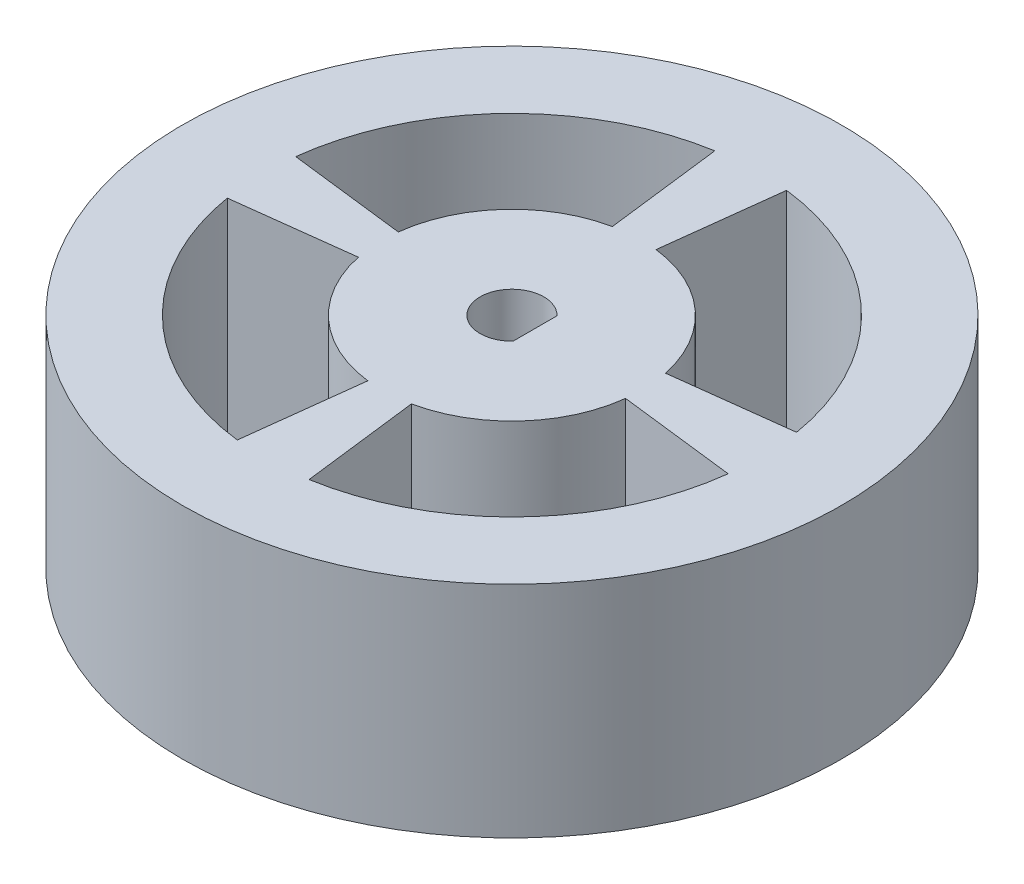
ISO-10303-21;
HEADER;
FILE_DESCRIPTION(('STEP AP214'),'2;1');
FILE_NAME('part.step','',(''),(''),'','','');
FILE_SCHEMA(('AUTOMOTIVE_DESIGN { 1 0 10303 214 1 1 1 1 }'));
ENDSEC;
DATA;
#1=APPLICATION_CONTEXT('core data for automotive mechanical design processes');
#2=APPLICATION_PROTOCOL_DEFINITION('international standard','automotive_design',2000,#1);
#3=PRODUCT_CONTEXT('',#1,'mechanical');
#4=PRODUCT('Part','Part','',(#3));
#5=PRODUCT_RELATED_PRODUCT_CATEGORY('part','',(#4));
#6=PRODUCT_DEFINITION_FORMATION('','',#4);
#7=PRODUCT_DEFINITION_CONTEXT('part definition',#1,'design');
#8=PRODUCT_DEFINITION('design','',#6,#7);
#9=PRODUCT_DEFINITION_SHAPE('','',#8);
#10=(LENGTH_UNIT() NAMED_UNIT(*) SI_UNIT(.MILLI.,.METRE.));
#11=(NAMED_UNIT(*) PLANE_ANGLE_UNIT() SI_UNIT($,.RADIAN.));
#12=(NAMED_UNIT(*) SI_UNIT($,.STERADIAN.) SOLID_ANGLE_UNIT());
#13=UNCERTAINTY_MEASURE_WITH_UNIT(LENGTH_MEASURE(1.E-05),#10,'distance_accuracy_value','');
#14=(GEOMETRIC_REPRESENTATION_CONTEXT(3) GLOBAL_UNCERTAINTY_ASSIGNED_CONTEXT((#13)) GLOBAL_UNIT_ASSIGNED_CONTEXT((#10,
#11,#12)) REPRESENTATION_CONTEXT('',''));
#15=CARTESIAN_POINT('',(0.,0.,0.));
#16=DIRECTION('',(0.,0.,1.));
#17=DIRECTION('',(1.,0.,0.));
#18=AXIS2_PLACEMENT_3D('',#15,#16,#17);
#19=CARTESIAN_POINT('',(0.,10.,0.));
#20=DIRECTION('',(0.,1.,0.));
#21=DIRECTION('',(0.,0.,1.));
#22=AXIS2_PLACEMENT_3D('',#19,#20,#21);
#23=PLANE('',#22);
#24=CARTESIAN_POINT('',(0.,10.,0.));
#25=DIRECTION('',(0.,1.,0.));
#26=DIRECTION('',(0.,0.,1.));
#27=AXIS2_PLACEMENT_3D('',#24,#25,#26);
#28=CIRCLE('',#27,15.);
#29=CARTESIAN_POINT('',(0.,10.,15.));
#30=VERTEX_POINT('',#29);
#31=EDGE_CURVE('E11',#30,#30,#28,.T.);
#32=ORIENTED_EDGE('',*,*,#31,.T.);
#33=EDGE_LOOP('',(#32));
#34=FACE_BOUND('',#33,.T.);
#35=DIRECTION('',(0.,0.,-1.));
#36=VECTOR('',#35,1.);
#37=CARTESIAN_POINT('',(1.05,10.,1.));
#38=LINE('',#37,#36);
#39=CARTESIAN_POINT('',(1.05,10.,1.));
#40=VERTEX_POINT('',#39);
#41=CARTESIAN_POINT('',(1.05,10.,-1.));
#42=VERTEX_POINT('',#41);
#43=EDGE_CURVE('E346',#40,#42,#38,.T.);
#44=ORIENTED_EDGE('',*,*,#43,.F.);
#45=CARTESIAN_POINT('',(0.,10.,0.));
#46=DIRECTION('',(0.,1.,0.));
#47=DIRECTION('',(0.,0.,-1.));
#48=AXIS2_PLACEMENT_3D('',#45,#46,#47);
#49=CIRCLE('',#48,1.45);
#50=EDGE_CURVE('E342',#42,#40,#49,.T.);
#51=ORIENTED_EDGE('',*,*,#50,.F.);
#52=EDGE_LOOP('',(#44,#51));
#53=FACE_BOUND('',#52,.T.);
#54=DIRECTION('',(0.122015532527619,0.,0.992528190945729));
#55=VECTOR('',#54,1.);
#56=CARTESIAN_POINT('',(1.20846299032433,10.,5.78116292968569));
#57=LINE('',#56,#55);
#58=CARTESIAN_POINT('',(1.20846299032433,10.,5.78116292968569));
#59=VERTEX_POINT('',#58);
#60=CARTESIAN_POINT('',(1.86170101699793,10.,11.0948893335314));
#61=VERTEX_POINT('',#60);
#62=EDGE_CURVE('E302',#59,#61,#57,.T.);
#63=ORIENTED_EDGE('',*,*,#62,.F.);
#64=CARTESIAN_POINT('',(0.,10.,0.));
#65=DIRECTION('',(0.,-1.,0.));
#66=DIRECTION('',(0.,0.,-1.));
#67=AXIS2_PLACEMENT_3D('',#64,#65,#66);
#68=CIRCLE('',#67,5.90611781279002);
#69=CARTESIAN_POINT('',(5.86524818391062,10.,0.693607496851631));
#70=VERTEX_POINT('',#69);
#71=EDGE_CURVE('E299',#70,#59,#68,.T.);
#72=ORIENTED_EDGE('',*,*,#71,.F.);
#73=DIRECTION('',(-0.992884130432348,0.,-0.11908443867945));
#74=VECTOR('',#73,1.);
#75=CARTESIAN_POINT('',(5.86524818391062,10.,0.693607496851631));
#76=LINE('',#75,#74);
#77=CARTESIAN_POINT('',(11.1711078276674,10.,1.32998116626821));
#78=VERTEX_POINT('',#77);
#79=EDGE_CURVE('E310',#78,#70,#76,.T.);
#80=ORIENTED_EDGE('',*,*,#79,.F.);
#81=CARTESIAN_POINT('',(0.,10.,0.));
#82=DIRECTION('',(0.,1.,0.));
#83=DIRECTION('',(0.,0.,-1.));
#84=AXIS2_PLACEMENT_3D('',#81,#82,#83);
#85=CIRCLE('',#84,11.25);
#86=EDGE_CURVE('E306',#61,#78,#85,.T.);
#87=ORIENTED_EDGE('',*,*,#86,.F.);
#88=EDGE_LOOP('',(#63,#72,#80,#87));
#89=FACE_BOUND('',#88,.T.);
#90=DIRECTION('',(-0.992528190945729,0.,0.122015532527619));
#91=VECTOR('',#90,1.);
#92=CARTESIAN_POINT('',(-5.78116292968569,10.,1.20846299032433));
#93=LINE('',#92,#91);
#94=CARTESIAN_POINT('',(-5.78116292968569,10.,1.20846299032433));
#95=VERTEX_POINT('',#94);
#96=CARTESIAN_POINT('',(-11.0948893335314,10.,1.86170101699793));
#97=VERTEX_POINT('',#96);
#98=EDGE_CURVE('E259',#95,#97,#93,.T.);
#99=ORIENTED_EDGE('',*,*,#98,.F.);
#100=CARTESIAN_POINT('',(0.,10.,0.));
#101=DIRECTION('',(0.,-1.,0.));
#102=DIRECTION('',(0.,0.,-1.));
#103=AXIS2_PLACEMENT_3D('',#100,#101,#102);
#104=CIRCLE('',#103,5.90611781279002);
#105=CARTESIAN_POINT('',(-0.693607496851652,10.,5.86524818391062));
#106=VERTEX_POINT('',#105);
#107=EDGE_CURVE('E256',#106,#95,#104,.T.);
#108=ORIENTED_EDGE('',*,*,#107,.F.);
#109=DIRECTION('',(0.119084438679446,0.,-0.992884130432349));
#110=VECTOR('',#109,1.);
#111=CARTESIAN_POINT('',(-0.693607496851652,10.,5.86524818391062));
#112=LINE('',#111,#110);
#113=CARTESIAN_POINT('',(-1.32998116626821,10.,11.1711078276674));
#114=VERTEX_POINT('',#113);
#115=EDGE_CURVE('E267',#114,#106,#112,.T.);
#116=ORIENTED_EDGE('',*,*,#115,.F.);
#117=CARTESIAN_POINT('',(0.,10.,0.));
#118=DIRECTION('',(0.,1.,0.));
#119=DIRECTION('',(0.,0.,-1.));
#120=AXIS2_PLACEMENT_3D('',#117,#118,#119);
#121=CIRCLE('',#120,11.25);
#122=EDGE_CURVE('E263',#97,#114,#121,.T.);
#123=ORIENTED_EDGE('',*,*,#122,.F.);
#124=EDGE_LOOP('',(#99,#108,#116,#123));
#125=FACE_BOUND('',#124,.T.);
#126=DIRECTION('',(-0.122015532527619,0.,-0.992528190945729));
#127=VECTOR('',#126,1.);
#128=CARTESIAN_POINT('',(-1.20846299032433,10.,-5.78116292968569));
#129=LINE('',#128,#127);
#130=CARTESIAN_POINT('',(-1.20846299032433,10.,-5.78116292968569));
#131=VERTEX_POINT('',#130);
#132=CARTESIAN_POINT('',(-1.86170101699793,10.,-11.0948893335314));
#133=VERTEX_POINT('',#132);
#134=EDGE_CURVE('E216',#131,#133,#129,.T.);
#135=ORIENTED_EDGE('',*,*,#134,.F.);
#136=CARTESIAN_POINT('',(0.,10.,0.));
#137=DIRECTION('',(0.,-1.,0.));
#138=DIRECTION('',(0.,0.,-1.));
#139=AXIS2_PLACEMENT_3D('',#136,#137,#138);
#140=CIRCLE('',#139,5.90611781279002);
#141=CARTESIAN_POINT('',(-5.86524818391061,10.,-0.693607496851674));
#142=VERTEX_POINT('',#141);
#143=EDGE_CURVE('E213',#142,#131,#140,.T.);
#144=ORIENTED_EDGE('',*,*,#143,.F.);
#145=DIRECTION('',(0.992884130432349,0.,0.119084438679442));
#146=VECTOR('',#145,1.);
#147=CARTESIAN_POINT('',(-5.86524818391061,10.,-0.693607496851674));
#148=LINE('',#147,#146);
#149=CARTESIAN_POINT('',(-11.1711078276674,10.,-1.32998116626821));
#150=VERTEX_POINT('',#149);
#151=EDGE_CURVE('E224',#150,#142,#148,.T.);
#152=ORIENTED_EDGE('',*,*,#151,.F.);
#153=CARTESIAN_POINT('',(0.,10.,0.));
#154=DIRECTION('',(0.,1.,0.));
#155=DIRECTION('',(0.,0.,-1.));
#156=AXIS2_PLACEMENT_3D('',#153,#154,#155);
#157=CIRCLE('',#156,11.25);
#158=EDGE_CURVE('E220',#133,#150,#157,.T.);
#159=ORIENTED_EDGE('',*,*,#158,.F.);
#160=EDGE_LOOP('',(#135,#144,#152,#159));
#161=FACE_BOUND('',#160,.T.);
#162=DIRECTION('',(0.992528190945729,0.,-0.122015532527619));
#163=VECTOR('',#162,1.);
#164=CARTESIAN_POINT('',(5.78116292968569,10.,-1.20846299032433));
#165=LINE('',#164,#163);
#166=CARTESIAN_POINT('',(5.78116292968569,10.,-1.20846299032433));
#167=VERTEX_POINT('',#166);
#168=CARTESIAN_POINT('',(11.0948893335314,10.,-1.86170101699793));
#169=VERTEX_POINT('',#168);
#170=EDGE_CURVE('E174',#167,#169,#165,.T.);
#171=ORIENTED_EDGE('',*,*,#170,.F.);
#172=CARTESIAN_POINT('',(0.,10.,0.));
#173=DIRECTION('',(0.,-1.,0.));
#174=DIRECTION('',(0.,0.,-1.));
#175=AXIS2_PLACEMENT_3D('',#172,#173,#174);
#176=CIRCLE('',#175,5.90611781279003);
#177=CARTESIAN_POINT('',(0.693607496851692,10.,-5.86524818391061));
#178=VERTEX_POINT('',#177);
#179=EDGE_CURVE('E165',#178,#167,#176,.T.);
#180=ORIENTED_EDGE('',*,*,#179,.F.);
#181=DIRECTION('',(-0.119084438679439,0.,0.99288413043235));
#182=VECTOR('',#181,1.);
#183=CARTESIAN_POINT('',(0.693607496851692,10.,-5.86524818391061));
#184=LINE('',#183,#182);
#185=CARTESIAN_POINT('',(1.32998116626821,10.,-11.1711078276674));
#186=VERTEX_POINT('',#185);
#187=EDGE_CURVE('E191',#186,#178,#184,.T.);
#188=ORIENTED_EDGE('',*,*,#187,.F.);
#189=CARTESIAN_POINT('',(0.,10.,0.));
#190=DIRECTION('',(0.,1.,0.));
#191=DIRECTION('',(0.,0.,-1.));
#192=AXIS2_PLACEMENT_3D('',#189,#190,#191);
#193=CIRCLE('',#192,11.25);
#194=EDGE_CURVE('E187',#169,#186,#193,.T.);
#195=ORIENTED_EDGE('',*,*,#194,.F.);
#196=EDGE_LOOP('',(#171,#180,#188,#195));
#197=FACE_BOUND('',#196,.T.);
#198=ADVANCED_FACE('F39',(#34,#53,#89,#125,#161,#197),#23,.T.);
#199=CARTESIAN_POINT('',(0.,0.,0.));
#200=DIRECTION('',(0.,1.,0.));
#201=DIRECTION('',(0.,0.,1.));
#202=AXIS2_PLACEMENT_3D('',#199,#200,#201);
#203=PLANE('',#202);
#204=CARTESIAN_POINT('',(0.,0.,0.));
#205=DIRECTION('',(0.,-1.,0.));
#206=DIRECTION('',(0.,0.,-1.));
#207=AXIS2_PLACEMENT_3D('',#204,#205,#206);
#208=CIRCLE('',#207,5.90611781279002);
#209=CARTESIAN_POINT('',(-5.86524818391061,0.,-0.693607496851674));
#210=VERTEX_POINT('',#209);
#211=CARTESIAN_POINT('',(-1.20846299032433,0.,-5.78116292968569));
#212=VERTEX_POINT('',#211);
#213=EDGE_CURVE('E183',#210,#212,#208,.T.);
#214=ORIENTED_EDGE('',*,*,#213,.T.);
#215=DIRECTION('',(-0.122015532527619,0.,-0.992528190945729));
#216=VECTOR('',#215,1.);
#217=CARTESIAN_POINT('',(-1.20846299032433,0.,-5.78116292968569));
#218=LINE('',#217,#216);
#219=CARTESIAN_POINT('',(-1.86170101699793,0.,-11.0948893335314));
#220=VERTEX_POINT('',#219);
#221=EDGE_CURVE('E231',#212,#220,#218,.T.);
#222=ORIENTED_EDGE('',*,*,#221,.T.);
#223=CARTESIAN_POINT('',(0.,0.,0.));
#224=DIRECTION('',(0.,1.,0.));
#225=DIRECTION('',(0.,0.,-1.));
#226=AXIS2_PLACEMENT_3D('',#223,#224,#225);
#227=CIRCLE('',#226,11.25);
#228=CARTESIAN_POINT('',(-11.1711078276674,0.,-1.32998116626821));
#229=VERTEX_POINT('',#228);
#230=EDGE_CURVE('E235',#220,#229,#227,.T.);
#231=ORIENTED_EDGE('',*,*,#230,.T.);
#232=DIRECTION('',(0.992884130432349,0.,0.119084438679442));
#233=VECTOR('',#232,1.);
#234=CARTESIAN_POINT('',(-5.86524818391061,0.,-0.693607496851674));
#235=LINE('',#234,#233);
#236=EDGE_CURVE('E217',#229,#210,#235,.T.);
#237=ORIENTED_EDGE('',*,*,#236,.T.);
#238=EDGE_LOOP('',(#214,#222,#231,#237));
#239=FACE_BOUND('',#238,.T.);
#240=CARTESIAN_POINT('',(0.,0.,0.));
#241=DIRECTION('',(0.,-1.,0.));
#242=DIRECTION('',(0.,0.,-1.));
#243=AXIS2_PLACEMENT_3D('',#240,#241,#242);
#244=CIRCLE('',#243,5.90611781279002);
#245=CARTESIAN_POINT('',(5.86524818391062,0.,0.693607496851631));
#246=VERTEX_POINT('',#245);
#247=CARTESIAN_POINT('',(1.20846299032433,0.,5.78116292968569));
#248=VERTEX_POINT('',#247);
#249=EDGE_CURVE('E298',#246,#248,#244,.T.);
#250=ORIENTED_EDGE('',*,*,#249,.T.);
#251=DIRECTION('',(0.122015532527619,0.,0.992528190945729));
#252=VECTOR('',#251,1.);
#253=CARTESIAN_POINT('',(1.20846299032433,0.,5.78116292968569));
#254=LINE('',#253,#252);
#255=CARTESIAN_POINT('',(1.86170101699793,0.,11.0948893335314));
#256=VERTEX_POINT('',#255);
#257=EDGE_CURVE('E317',#248,#256,#254,.T.);
#258=ORIENTED_EDGE('',*,*,#257,.T.);
#259=CARTESIAN_POINT('',(0.,0.,0.));
#260=DIRECTION('',(0.,1.,0.));
#261=DIRECTION('',(0.,0.,-1.));
#262=AXIS2_PLACEMENT_3D('',#259,#260,#261);
#263=CIRCLE('',#262,11.25);
#264=CARTESIAN_POINT('',(11.1711078276674,0.,1.32998116626821));
#265=VERTEX_POINT('',#264);
#266=EDGE_CURVE('E321',#256,#265,#263,.T.);
#267=ORIENTED_EDGE('',*,*,#266,.T.);
#268=DIRECTION('',(-0.992884130432348,0.,-0.11908443867945));
#269=VECTOR('',#268,1.);
#270=CARTESIAN_POINT('',(5.86524818391062,0.,0.693607496851631));
#271=LINE('',#270,#269);
#272=EDGE_CURVE('E303',#265,#246,#271,.T.);
#273=ORIENTED_EDGE('',*,*,#272,.T.);
#274=EDGE_LOOP('',(#250,#258,#267,#273));
#275=FACE_BOUND('',#274,.T.);
#276=CARTESIAN_POINT('',(0.,0.,0.));
#277=DIRECTION('',(0.,1.,0.));
#278=DIRECTION('',(0.,0.,1.));
#279=AXIS2_PLACEMENT_3D('',#276,#277,#278);
#280=CIRCLE('',#279,15.);
#281=CARTESIAN_POINT('',(0.,0.,15.));
#282=VERTEX_POINT('',#281);
#283=EDGE_CURVE('E43',#282,#282,#280,.T.);
#284=ORIENTED_EDGE('',*,*,#283,.F.);
#285=EDGE_LOOP('',(#284));
#286=FACE_BOUND('',#285,.T.);
#287=CARTESIAN_POINT('',(0.,0.,0.));
#288=DIRECTION('',(0.,1.,0.));
#289=DIRECTION('',(0.,0.,-1.));
#290=AXIS2_PLACEMENT_3D('',#287,#288,#289);
#291=CIRCLE('',#290,1.45);
#292=CARTESIAN_POINT('',(1.05,0.,-1.));
#293=VERTEX_POINT('',#292);
#294=CARTESIAN_POINT('',(1.05,0.,1.));
#295=VERTEX_POINT('',#294);
#296=EDGE_CURVE('E341',#293,#295,#291,.T.);
#297=ORIENTED_EDGE('',*,*,#296,.T.);
#298=DIRECTION('',(0.,0.,-1.));
#299=VECTOR('',#298,1.);
#300=CARTESIAN_POINT('',(1.05,0.,1.));
#301=LINE('',#300,#299);
#302=EDGE_CURVE('E347',#295,#293,#301,.T.);
#303=ORIENTED_EDGE('',*,*,#302,.T.);
#304=EDGE_LOOP('',(#297,#303));
#305=FACE_BOUND('',#304,.T.);
#306=CARTESIAN_POINT('',(0.,0.,0.));
#307=DIRECTION('',(0.,-1.,0.));
#308=DIRECTION('',(0.,0.,-1.));
#309=AXIS2_PLACEMENT_3D('',#306,#307,#308);
#310=CIRCLE('',#309,5.90611781279002);
#311=CARTESIAN_POINT('',(-0.693607496851652,0.,5.86524818391062));
#312=VERTEX_POINT('',#311);
#313=CARTESIAN_POINT('',(-5.78116292968569,0.,1.20846299032433));
#314=VERTEX_POINT('',#313);
#315=EDGE_CURVE('E255',#312,#314,#310,.T.);
#316=ORIENTED_EDGE('',*,*,#315,.T.);
#317=DIRECTION('',(-0.992528190945729,0.,0.122015532527619));
#318=VECTOR('',#317,1.);
#319=CARTESIAN_POINT('',(-5.78116292968569,0.,1.20846299032433));
#320=LINE('',#319,#318);
#321=CARTESIAN_POINT('',(-11.0948893335314,0.,1.86170101699793));
#322=VERTEX_POINT('',#321);
#323=EDGE_CURVE('E274',#314,#322,#320,.T.);
#324=ORIENTED_EDGE('',*,*,#323,.T.);
#325=CARTESIAN_POINT('',(0.,0.,0.));
#326=DIRECTION('',(0.,1.,0.));
#327=DIRECTION('',(0.,0.,-1.));
#328=AXIS2_PLACEMENT_3D('',#325,#326,#327);
#329=CIRCLE('',#328,11.25);
#330=CARTESIAN_POINT('',(-1.32998116626821,0.,11.1711078276674));
#331=VERTEX_POINT('',#330);
#332=EDGE_CURVE('E278',#322,#331,#329,.T.);
#333=ORIENTED_EDGE('',*,*,#332,.T.);
#334=DIRECTION('',(0.119084438679446,0.,-0.992884130432349));
#335=VECTOR('',#334,1.);
#336=CARTESIAN_POINT('',(-0.693607496851652,0.,5.86524818391062));
#337=LINE('',#336,#335);
#338=EDGE_CURVE('E260',#331,#312,#337,.T.);
#339=ORIENTED_EDGE('',*,*,#338,.T.);
#340=EDGE_LOOP('',(#316,#324,#333,#339));
#341=FACE_BOUND('',#340,.T.);
#342=CARTESIAN_POINT('',(0.,0.,0.));
#343=DIRECTION('',(0.,-1.,0.));
#344=DIRECTION('',(0.,0.,-1.));
#345=AXIS2_PLACEMENT_3D('',#342,#343,#344);
#346=CIRCLE('',#345,5.90611781279003);
#347=CARTESIAN_POINT('',(0.693607496851692,0.,-5.86524818391061));
#348=VERTEX_POINT('',#347);
#349=CARTESIAN_POINT('',(5.78116292968569,0.,-1.20846299032433));
#350=VERTEX_POINT('',#349);
#351=EDGE_CURVE('E63',#348,#350,#346,.T.);
#352=ORIENTED_EDGE('',*,*,#351,.T.);
#353=DIRECTION('',(0.992528190945729,0.,-0.122015532527619));
#354=VECTOR('',#353,1.);
#355=CARTESIAN_POINT('',(5.78116292968569,0.,-1.20846299032433));
#356=LINE('',#355,#354);
#357=CARTESIAN_POINT('',(11.0948893335314,0.,-1.86170101699793));
#358=VERTEX_POINT('',#357);
#359=EDGE_CURVE('E181',#350,#358,#356,.T.);
#360=ORIENTED_EDGE('',*,*,#359,.T.);
#361=CARTESIAN_POINT('',(0.,0.,0.));
#362=DIRECTION('',(0.,1.,0.));
#363=DIRECTION('',(0.,0.,-1.));
#364=AXIS2_PLACEMENT_3D('',#361,#362,#363);
#365=CIRCLE('',#364,11.25);
#366=CARTESIAN_POINT('',(1.32998116626821,0.,-11.1711078276674));
#367=VERTEX_POINT('',#366);
#368=EDGE_CURVE('E200',#358,#367,#365,.T.);
#369=ORIENTED_EDGE('',*,*,#368,.T.);
#370=DIRECTION('',(-0.119084438679439,0.,0.99288413043235));
#371=VECTOR('',#370,1.);
#372=CARTESIAN_POINT('',(0.693607496851692,0.,-5.86524818391061));
#373=LINE('',#372,#371);
#374=EDGE_CURVE('E175',#367,#348,#373,.T.);
#375=ORIENTED_EDGE('',*,*,#374,.T.);
#376=EDGE_LOOP('',(#352,#360,#369,#375));
#377=FACE_BOUND('',#376,.T.);
#378=ADVANCED_FACE('F369',(#239,#275,#286,#305,#341,#377),#203,.F.);
#379=CARTESIAN_POINT('',(0.,10.,0.));
#380=DIRECTION('',(0.,-1.,0.));
#381=DIRECTION('',(0.,0.,-1.));
#382=AXIS2_PLACEMENT_3D('',#379,#380,#381);
#383=CYLINDRICAL_SURFACE('',#382,15.);
#384=ORIENTED_EDGE('',*,*,#31,.F.);
#385=EDGE_LOOP('',(#384));
#386=FACE_BOUND('',#385,.T.);
#387=ORIENTED_EDGE('',*,*,#283,.T.);
#388=EDGE_LOOP('',(#387));
#389=FACE_BOUND('',#388,.T.);
#390=ADVANCED_FACE('F41',(#386,#389),#383,.T.);
#391=CARTESIAN_POINT('',(0.,10.,0.));
#392=DIRECTION('',(0.,-1.,0.));
#393=DIRECTION('',(0.,0.,-1.));
#394=AXIS2_PLACEMENT_3D('',#391,#392,#393);
#395=CYLINDRICAL_SURFACE('',#394,1.45);
#396=ORIENTED_EDGE('',*,*,#296,.F.);
#397=DIRECTION('',(0.,-1.,0.));
#398=VECTOR('',#397,1.);
#399=CARTESIAN_POINT('',(1.05,10.,-1.));
#400=LINE('',#399,#398);
#401=EDGE_CURVE('E350',#42,#293,#400,.T.);
#402=ORIENTED_EDGE('',*,*,#401,.F.);
#403=ORIENTED_EDGE('',*,*,#50,.T.);
#404=DIRECTION('',(0.,-1.,0.));
#405=VECTOR('',#404,1.);
#406=CARTESIAN_POINT('',(1.05,10.,1.));
#407=LINE('',#406,#405);
#408=EDGE_CURVE('E360',#40,#295,#407,.T.);
#409=ORIENTED_EDGE('',*,*,#408,.T.);
#410=EDGE_LOOP('',(#396,#402,#403,#409));
#411=FACE_BOUND('',#410,.T.);
#412=ADVANCED_FACE('F392',(#411),#395,.F.);
#413=CARTESIAN_POINT('',(1.05,10.,1.));
#414=DIRECTION('',(-1.,0.,0.));
#415=DIRECTION('',(0.,0.,1.));
#416=AXIS2_PLACEMENT_3D('',#413,#414,#415);
#417=PLANE('',#416);
#418=ORIENTED_EDGE('',*,*,#302,.F.);
#419=ORIENTED_EDGE('',*,*,#408,.F.);
#420=ORIENTED_EDGE('',*,*,#43,.T.);
#421=ORIENTED_EDGE('',*,*,#401,.T.);
#422=EDGE_LOOP('',(#418,#419,#420,#421));
#423=FACE_BOUND('',#422,.T.);
#424=ADVANCED_FACE('F395',(#423),#417,.T.);
#425=CARTESIAN_POINT('',(0.,10.,0.));
#426=DIRECTION('',(0.,-1.,0.));
#427=DIRECTION('',(0.,0.,-1.));
#428=AXIS2_PLACEMENT_3D('',#425,#426,#427);
#429=CYLINDRICAL_SURFACE('',#428,5.90611781279002);
#430=ORIENTED_EDGE('',*,*,#249,.F.);
#431=DIRECTION('',(0.,-1.,0.));
#432=VECTOR('',#431,1.);
#433=CARTESIAN_POINT('',(5.86524818391062,10.,0.693607496851631));
#434=LINE('',#433,#432);
#435=EDGE_CURVE('E313',#70,#246,#434,.T.);
#436=ORIENTED_EDGE('',*,*,#435,.F.);
#437=ORIENTED_EDGE('',*,*,#71,.T.);
#438=DIRECTION('',(0.,-1.,0.));
#439=VECTOR('',#438,1.);
#440=CARTESIAN_POINT('',(1.20846299032433,10.,5.78116292968569));
#441=LINE('',#440,#439);
#442=EDGE_CURVE('E337',#59,#248,#441,.T.);
#443=ORIENTED_EDGE('',*,*,#442,.T.);
#444=EDGE_LOOP('',(#430,#436,#437,#443));
#445=FACE_BOUND('',#444,.T.);
#446=ADVANCED_FACE('F398',(#445),#429,.T.);
#447=CARTESIAN_POINT('',(1.20846299032433,10.,5.78116292968569));
#448=DIRECTION('',(0.992528190945729,0.,-0.122015532527619));
#449=DIRECTION('',(-0.122015532527619,0.,-0.992528190945729));
#450=AXIS2_PLACEMENT_3D('',#447,#448,#449);
#451=PLANE('',#450);
#452=ORIENTED_EDGE('',*,*,#257,.F.);
#453=ORIENTED_EDGE('',*,*,#442,.F.);
#454=ORIENTED_EDGE('',*,*,#62,.T.);
#455=DIRECTION('',(0.,-1.,0.));
#456=VECTOR('',#455,1.);
#457=CARTESIAN_POINT('',(1.86170101699793,10.,11.0948893335314));
#458=LINE('',#457,#456);
#459=EDGE_CURVE('E334',#61,#256,#458,.T.);
#460=ORIENTED_EDGE('',*,*,#459,.T.);
#461=EDGE_LOOP('',(#452,#453,#454,#460));
#462=FACE_BOUND('',#461,.T.);
#463=ADVANCED_FACE('F402',(#462),#451,.T.);
#464=CARTESIAN_POINT('',(0.,10.,0.));
#465=DIRECTION('',(0.,-1.,0.));
#466=DIRECTION('',(0.,0.,-1.));
#467=AXIS2_PLACEMENT_3D('',#464,#465,#466);
#468=CYLINDRICAL_SURFACE('',#467,11.25);
#469=ORIENTED_EDGE('',*,*,#266,.F.);
#470=ORIENTED_EDGE('',*,*,#459,.F.);
#471=ORIENTED_EDGE('',*,*,#86,.T.);
#472=DIRECTION('',(0.,-1.,0.));
#473=VECTOR('',#472,1.);
#474=CARTESIAN_POINT('',(11.1711078276674,10.,1.32998116626821));
#475=LINE('',#474,#473);
#476=EDGE_CURVE('E331',#78,#265,#475,.T.);
#477=ORIENTED_EDGE('',*,*,#476,.T.);
#478=EDGE_LOOP('',(#469,#470,#471,#477));
#479=FACE_BOUND('',#478,.T.);
#480=ADVANCED_FACE('F406',(#479),#468,.F.);
#481=CARTESIAN_POINT('',(5.86524818391062,10.,0.693607496851631));
#482=DIRECTION('',(-0.11908443867945,0.,0.992884130432348));
#483=DIRECTION('',(0.992884130432348,0.,0.11908443867945));
#484=AXIS2_PLACEMENT_3D('',#481,#482,#483);
#485=PLANE('',#484);
#486=ORIENTED_EDGE('',*,*,#272,.F.);
#487=ORIENTED_EDGE('',*,*,#476,.F.);
#488=ORIENTED_EDGE('',*,*,#79,.T.);
#489=ORIENTED_EDGE('',*,*,#435,.T.);
#490=EDGE_LOOP('',(#486,#487,#488,#489));
#491=FACE_BOUND('',#490,.T.);
#492=ADVANCED_FACE('F410',(#491),#485,.T.);
#493=CARTESIAN_POINT('',(0.,10.,0.));
#494=DIRECTION('',(0.,-1.,0.));
#495=DIRECTION('',(0.,0.,-1.));
#496=AXIS2_PLACEMENT_3D('',#493,#494,#495);
#497=CYLINDRICAL_SURFACE('',#496,5.90611781279002);
#498=ORIENTED_EDGE('',*,*,#315,.F.);
#499=DIRECTION('',(0.,-1.,0.));
#500=VECTOR('',#499,1.);
#501=CARTESIAN_POINT('',(-0.693607496851652,10.,5.86524818391062));
#502=LINE('',#501,#500);
#503=EDGE_CURVE('E270',#106,#312,#502,.T.);
#504=ORIENTED_EDGE('',*,*,#503,.F.);
#505=ORIENTED_EDGE('',*,*,#107,.T.);
#506=DIRECTION('',(0.,-1.,0.));
#507=VECTOR('',#506,1.);
#508=CARTESIAN_POINT('',(-5.78116292968569,10.,1.20846299032433));
#509=LINE('',#508,#507);
#510=EDGE_CURVE('E294',#95,#314,#509,.T.);
#511=ORIENTED_EDGE('',*,*,#510,.T.);
#512=EDGE_LOOP('',(#498,#504,#505,#511));
#513=FACE_BOUND('',#512,.T.);
#514=ADVANCED_FACE('F414',(#513),#497,.T.);
#515=CARTESIAN_POINT('',(-5.78116292968569,10.,1.20846299032433));
#516=DIRECTION('',(0.122015532527619,0.,0.992528190945729));
#517=DIRECTION('',(0.992528190945729,0.,-0.122015532527619));
#518=AXIS2_PLACEMENT_3D('',#515,#516,#517);
#519=PLANE('',#518);
#520=ORIENTED_EDGE('',*,*,#323,.F.);
#521=ORIENTED_EDGE('',*,*,#510,.F.);
#522=ORIENTED_EDGE('',*,*,#98,.T.);
#523=DIRECTION('',(0.,-1.,0.));
#524=VECTOR('',#523,1.);
#525=CARTESIAN_POINT('',(-11.0948893335314,10.,1.86170101699793));
#526=LINE('',#525,#524);
#527=EDGE_CURVE('E291',#97,#322,#526,.T.);
#528=ORIENTED_EDGE('',*,*,#527,.T.);
#529=EDGE_LOOP('',(#520,#521,#522,#528));
#530=FACE_BOUND('',#529,.T.);
#531=ADVANCED_FACE('F418',(#530),#519,.T.);
#532=CARTESIAN_POINT('',(0.,10.,0.));
#533=DIRECTION('',(0.,-1.,0.));
#534=DIRECTION('',(0.,0.,-1.));
#535=AXIS2_PLACEMENT_3D('',#532,#533,#534);
#536=CYLINDRICAL_SURFACE('',#535,11.25);
#537=ORIENTED_EDGE('',*,*,#332,.F.);
#538=ORIENTED_EDGE('',*,*,#527,.F.);
#539=ORIENTED_EDGE('',*,*,#122,.T.);
#540=DIRECTION('',(0.,-1.,0.));
#541=VECTOR('',#540,1.);
#542=CARTESIAN_POINT('',(-1.32998116626821,10.,11.1711078276674));
#543=LINE('',#542,#541);
#544=EDGE_CURVE('E288',#114,#331,#543,.T.);
#545=ORIENTED_EDGE('',*,*,#544,.T.);
#546=EDGE_LOOP('',(#537,#538,#539,#545));
#547=FACE_BOUND('',#546,.T.);
#548=ADVANCED_FACE('F422',(#547),#536,.F.);
#549=CARTESIAN_POINT('',(-0.693607496851652,10.,5.86524818391062));
#550=DIRECTION('',(-0.992884130432349,0.,-0.119084438679446));
#551=DIRECTION('',(-0.119084438679446,0.,0.992884130432349));
#552=AXIS2_PLACEMENT_3D('',#549,#550,#551);
#553=PLANE('',#552);
#554=ORIENTED_EDGE('',*,*,#338,.F.);
#555=ORIENTED_EDGE('',*,*,#544,.F.);
#556=ORIENTED_EDGE('',*,*,#115,.T.);
#557=ORIENTED_EDGE('',*,*,#503,.T.);
#558=EDGE_LOOP('',(#554,#555,#556,#557));
#559=FACE_BOUND('',#558,.T.);
#560=ADVANCED_FACE('F426',(#559),#553,.T.);
#561=CARTESIAN_POINT('',(0.,10.,0.));
#562=DIRECTION('',(0.,-1.,0.));
#563=DIRECTION('',(0.,0.,-1.));
#564=AXIS2_PLACEMENT_3D('',#561,#562,#563);
#565=CYLINDRICAL_SURFACE('',#564,5.90611781279002);
#566=ORIENTED_EDGE('',*,*,#213,.F.);
#567=DIRECTION('',(0.,-1.,0.));
#568=VECTOR('',#567,1.);
#569=CARTESIAN_POINT('',(-5.86524818391061,10.,-0.693607496851674));
#570=LINE('',#569,#568);
#571=EDGE_CURVE('E227',#142,#210,#570,.T.);
#572=ORIENTED_EDGE('',*,*,#571,.F.);
#573=ORIENTED_EDGE('',*,*,#143,.T.);
#574=DIRECTION('',(0.,-1.,0.));
#575=VECTOR('',#574,1.);
#576=CARTESIAN_POINT('',(-1.20846299032433,10.,-5.78116292968569));
#577=LINE('',#576,#575);
#578=EDGE_CURVE('E251',#131,#212,#577,.T.);
#579=ORIENTED_EDGE('',*,*,#578,.T.);
#580=EDGE_LOOP('',(#566,#572,#573,#579));
#581=FACE_BOUND('',#580,.T.);
#582=ADVANCED_FACE('F430',(#581),#565,.T.);
#583=CARTESIAN_POINT('',(-1.20846299032433,10.,-5.78116292968569));
#584=DIRECTION('',(-0.992528190945729,0.,0.122015532527619));
#585=DIRECTION('',(0.122015532527619,0.,0.992528190945729));
#586=AXIS2_PLACEMENT_3D('',#583,#584,#585);
#587=PLANE('',#586);
#588=ORIENTED_EDGE('',*,*,#221,.F.);
#589=ORIENTED_EDGE('',*,*,#578,.F.);
#590=ORIENTED_EDGE('',*,*,#134,.T.);
#591=DIRECTION('',(0.,-1.,0.));
#592=VECTOR('',#591,1.);
#593=CARTESIAN_POINT('',(-1.86170101699793,10.,-11.0948893335314));
#594=LINE('',#593,#592);
#595=EDGE_CURVE('E248',#133,#220,#594,.T.);
#596=ORIENTED_EDGE('',*,*,#595,.T.);
#597=EDGE_LOOP('',(#588,#589,#590,#596));
#598=FACE_BOUND('',#597,.T.);
#599=ADVANCED_FACE('F434',(#598),#587,.T.);
#600=CARTESIAN_POINT('',(0.,10.,0.));
#601=DIRECTION('',(0.,-1.,0.));
#602=DIRECTION('',(0.,0.,-1.));
#603=AXIS2_PLACEMENT_3D('',#600,#601,#602);
#604=CYLINDRICAL_SURFACE('',#603,11.25);
#605=ORIENTED_EDGE('',*,*,#230,.F.);
#606=ORIENTED_EDGE('',*,*,#595,.F.);
#607=ORIENTED_EDGE('',*,*,#158,.T.);
#608=DIRECTION('',(0.,-1.,0.));
#609=VECTOR('',#608,1.);
#610=CARTESIAN_POINT('',(-11.1711078276674,10.,-1.32998116626821));
#611=LINE('',#610,#609);
#612=EDGE_CURVE('E245',#150,#229,#611,.T.);
#613=ORIENTED_EDGE('',*,*,#612,.T.);
#614=EDGE_LOOP('',(#605,#606,#607,#613));
#615=FACE_BOUND('',#614,.T.);
#616=ADVANCED_FACE('F438',(#615),#604,.F.);
#617=CARTESIAN_POINT('',(-5.86524818391061,10.,-0.693607496851674));
#618=DIRECTION('',(0.119084438679442,0.,-0.992884130432349));
#619=DIRECTION('',(-0.992884130432349,0.,-0.119084438679442));
#620=AXIS2_PLACEMENT_3D('',#617,#618,#619);
#621=PLANE('',#620);
#622=ORIENTED_EDGE('',*,*,#236,.F.);
#623=ORIENTED_EDGE('',*,*,#612,.F.);
#624=ORIENTED_EDGE('',*,*,#151,.T.);
#625=ORIENTED_EDGE('',*,*,#571,.T.);
#626=EDGE_LOOP('',(#622,#623,#624,#625));
#627=FACE_BOUND('',#626,.T.);
#628=ADVANCED_FACE('F442',(#627),#621,.T.);
#629=CARTESIAN_POINT('',(0.,10.,0.));
#630=DIRECTION('',(0.,-1.,0.));
#631=DIRECTION('',(0.,0.,-1.));
#632=AXIS2_PLACEMENT_3D('',#629,#630,#631);
#633=CYLINDRICAL_SURFACE('',#632,5.90611781279003);
#634=ORIENTED_EDGE('',*,*,#351,.F.);
#635=DIRECTION('',(0.,-1.,0.));
#636=VECTOR('',#635,1.);
#637=CARTESIAN_POINT('',(0.693607496851692,10.,-5.86524818391061));
#638=LINE('',#637,#636);
#639=EDGE_CURVE('E169',#178,#348,#638,.T.);
#640=ORIENTED_EDGE('',*,*,#639,.F.);
#641=ORIENTED_EDGE('',*,*,#179,.T.);
#642=DIRECTION('',(0.,-1.,0.));
#643=VECTOR('',#642,1.);
#644=CARTESIAN_POINT('',(5.78116292968569,10.,-1.20846299032433));
#645=LINE('',#644,#643);
#646=EDGE_CURVE('E168',#167,#350,#645,.T.);
#647=ORIENTED_EDGE('',*,*,#646,.T.);
#648=EDGE_LOOP('',(#634,#640,#641,#647));
#649=FACE_BOUND('',#648,.T.);
#650=ADVANCED_FACE('F167',(#649),#633,.T.);
#651=CARTESIAN_POINT('',(5.78116292968569,10.,-1.20846299032433));
#652=DIRECTION('',(-0.122015532527619,0.,-0.992528190945729));
#653=DIRECTION('',(-0.992528190945729,0.,0.122015532527619));
#654=AXIS2_PLACEMENT_3D('',#651,#652,#653);
#655=PLANE('',#654);
#656=ORIENTED_EDGE('',*,*,#359,.F.);
#657=ORIENTED_EDGE('',*,*,#646,.F.);
#658=ORIENTED_EDGE('',*,*,#170,.T.);
#659=DIRECTION('',(0.,-1.,0.));
#660=VECTOR('',#659,1.);
#661=CARTESIAN_POINT('',(11.0948893335314,10.,-1.86170101699793));
#662=LINE('',#661,#660);
#663=EDGE_CURVE('E184',#169,#358,#662,.T.);
#664=ORIENTED_EDGE('',*,*,#663,.T.);
#665=EDGE_LOOP('',(#656,#657,#658,#664));
#666=FACE_BOUND('',#665,.T.);
#667=ADVANCED_FACE('F178',(#666),#655,.T.);
#668=CARTESIAN_POINT('',(0.,10.,0.));
#669=DIRECTION('',(0.,-1.,0.));
#670=DIRECTION('',(0.,0.,-1.));
#671=AXIS2_PLACEMENT_3D('',#668,#669,#670);
#672=CYLINDRICAL_SURFACE('',#671,11.25);
#673=ORIENTED_EDGE('',*,*,#368,.F.);
#674=ORIENTED_EDGE('',*,*,#663,.F.);
#675=ORIENTED_EDGE('',*,*,#194,.T.);
#676=DIRECTION('',(0.,-1.,0.));
#677=VECTOR('',#676,1.);
#678=CARTESIAN_POINT('',(1.32998116626821,10.,-11.1711078276674));
#679=LINE('',#678,#677);
#680=EDGE_CURVE('E55',#186,#367,#679,.T.);
#681=ORIENTED_EDGE('',*,*,#680,.T.);
#682=EDGE_LOOP('',(#673,#674,#675,#681));
#683=FACE_BOUND('',#682,.T.);
#684=ADVANCED_FACE('F378',(#683),#672,.F.);
#685=CARTESIAN_POINT('',(0.693607496851692,10.,-5.86524818391061));
#686=DIRECTION('',(0.99288413043235,0.,0.119084438679439));
#687=DIRECTION('',(0.119084438679439,0.,-0.99288413043235));
#688=AXIS2_PLACEMENT_3D('',#685,#686,#687);
#689=PLANE('',#688);
#690=ORIENTED_EDGE('',*,*,#374,.F.);
#691=ORIENTED_EDGE('',*,*,#680,.F.);
#692=ORIENTED_EDGE('',*,*,#187,.T.);
#693=ORIENTED_EDGE('',*,*,#639,.T.);
#694=EDGE_LOOP('',(#690,#691,#692,#693));
#695=FACE_BOUND('',#694,.T.);
#696=ADVANCED_FACE('F376',(#695),#689,.T.);
#697=CLOSED_SHELL('',(#198,#378,#390,#412,#424,#446,#463,#480,#492,#514,#531,#548,#560,#582,
#599,#616,#628,#650,#667,#684,#696));
#698=MANIFOLD_SOLID_BREP('B2',#697);
#699=ADVANCED_BREP_SHAPE_REPRESENTATION('',(#18,#698),#14);
#700=SHAPE_DEFINITION_REPRESENTATION(#9,#699);
ENDSEC;
END-ISO-10303-21;
